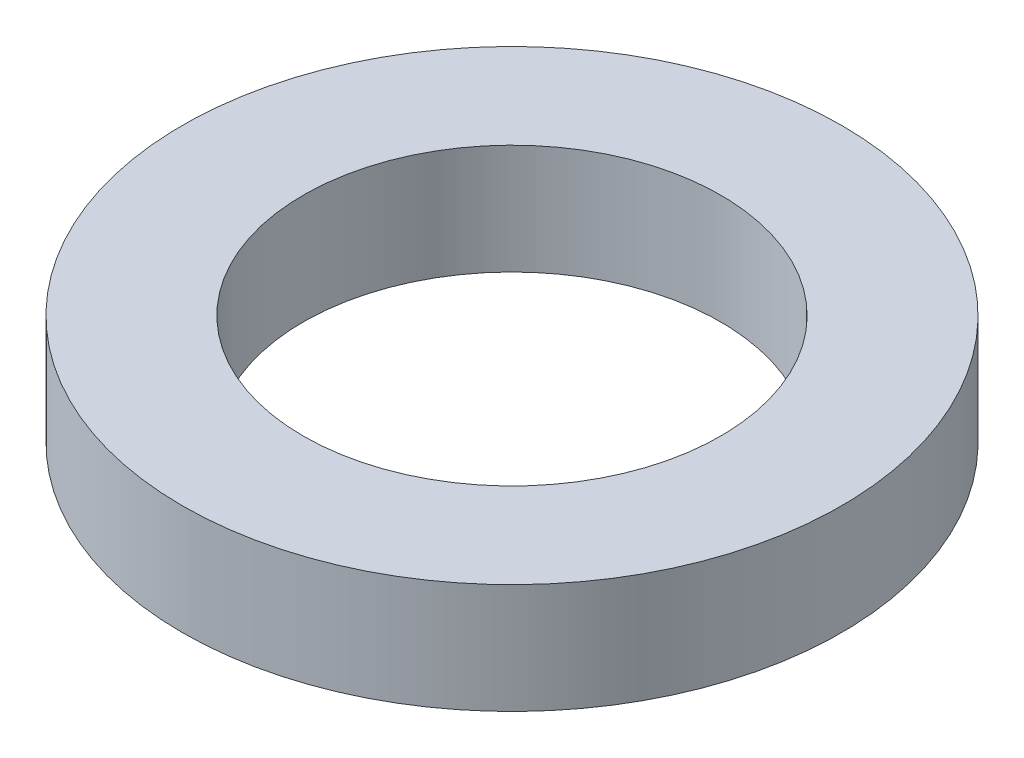
ISO-10303-21;
HEADER;
FILE_DESCRIPTION(('STEP AP214'),'2;1');
FILE_NAME('part.step','',(''),(''),'','','');
FILE_SCHEMA(('AUTOMOTIVE_DESIGN { 1 0 10303 214 1 1 1 1 }'));
ENDSEC;
DATA;
#1=APPLICATION_CONTEXT('core data for automotive mechanical design processes');
#2=APPLICATION_PROTOCOL_DEFINITION('international standard','automotive_design',2000,#1);
#3=PRODUCT_CONTEXT('',#1,'mechanical');
#4=PRODUCT('Part','Part','',(#3));
#5=PRODUCT_RELATED_PRODUCT_CATEGORY('part','',(#4));
#6=PRODUCT_DEFINITION_FORMATION('','',#4);
#7=PRODUCT_DEFINITION_CONTEXT('part definition',#1,'design');
#8=PRODUCT_DEFINITION('design','',#6,#7);
#9=PRODUCT_DEFINITION_SHAPE('','',#8);
#10=(LENGTH_UNIT() NAMED_UNIT(*) SI_UNIT(.MILLI.,.METRE.));
#11=(NAMED_UNIT(*) PLANE_ANGLE_UNIT() SI_UNIT($,.RADIAN.));
#12=(NAMED_UNIT(*) SI_UNIT($,.STERADIAN.) SOLID_ANGLE_UNIT());
#13=UNCERTAINTY_MEASURE_WITH_UNIT(LENGTH_MEASURE(1.E-05),#10,'distance_accuracy_value','');
#14=(GEOMETRIC_REPRESENTATION_CONTEXT(3) GLOBAL_UNCERTAINTY_ASSIGNED_CONTEXT((#13)) GLOBAL_UNIT_ASSIGNED_CONTEXT((#10,
#11,#12)) REPRESENTATION_CONTEXT('',''));
#15=CARTESIAN_POINT('',(0.,0.,0.));
#16=DIRECTION('',(0.,0.,1.));
#17=DIRECTION('',(1.,0.,0.));
#18=AXIS2_PLACEMENT_3D('',#15,#16,#17);
#19=CARTESIAN_POINT('',(0.,1.,0.));
#20=DIRECTION('',(0.,1.,0.));
#21=DIRECTION('',(0.,0.,1.));
#22=AXIS2_PLACEMENT_3D('',#19,#20,#21);
#23=PLANE('',#22);
#24=CARTESIAN_POINT('',(0.,1.,0.));
#25=DIRECTION('',(0.,1.,0.));
#26=DIRECTION('',(0.,0.,1.));
#27=AXIS2_PLACEMENT_3D('',#24,#25,#26);
#28=CIRCLE('',#27,3.);
#29=CARTESIAN_POINT('',(0.,1.,3.));
#30=VERTEX_POINT('',#29);
#31=EDGE_CURVE('E10',#30,#30,#28,.T.);
#32=ORIENTED_EDGE('',*,*,#31,.T.);
#33=EDGE_LOOP('',(#32));
#34=FACE_BOUND('',#33,.T.);
#35=CARTESIAN_POINT('',(0.,1.,0.));
#36=DIRECTION('',(0.,1.,0.));
#37=DIRECTION('',(0.,0.,1.));
#38=AXIS2_PLACEMENT_3D('',#35,#36,#37);
#39=CIRCLE('',#38,1.9);
#40=CARTESIAN_POINT('',(0.,1.,1.9));
#41=VERTEX_POINT('',#40);
#42=EDGE_CURVE('E54',#41,#41,#39,.T.);
#43=ORIENTED_EDGE('',*,*,#42,.F.);
#44=EDGE_LOOP('',(#43));
#45=FACE_BOUND('',#44,.T.);
#46=ADVANCED_FACE('F41',(#34,#45),#23,.T.);
#47=CARTESIAN_POINT('',(0.,0.,0.));
#48=DIRECTION('',(0.,1.,0.));
#49=DIRECTION('',(0.,0.,1.));
#50=AXIS2_PLACEMENT_3D('',#47,#48,#49);
#51=PLANE('',#50);
#52=CARTESIAN_POINT('',(0.,0.,0.));
#53=DIRECTION('',(0.,1.,0.));
#54=DIRECTION('',(0.,0.,1.));
#55=AXIS2_PLACEMENT_3D('',#52,#53,#54);
#56=CIRCLE('',#55,3.);
#57=CARTESIAN_POINT('',(0.,0.,3.));
#58=VERTEX_POINT('',#57);
#59=EDGE_CURVE('E45',#58,#58,#56,.T.);
#60=ORIENTED_EDGE('',*,*,#59,.F.);
#61=EDGE_LOOP('',(#60));
#62=FACE_BOUND('',#61,.T.);
#63=CARTESIAN_POINT('',(0.,0.,0.));
#64=DIRECTION('',(0.,1.,0.));
#65=DIRECTION('',(0.,0.,1.));
#66=AXIS2_PLACEMENT_3D('',#63,#64,#65);
#67=CIRCLE('',#66,1.9);
#68=CARTESIAN_POINT('',(0.,0.,1.9));
#69=VERTEX_POINT('',#68);
#70=EDGE_CURVE('E56',#69,#69,#67,.T.);
#71=ORIENTED_EDGE('',*,*,#70,.T.);
#72=EDGE_LOOP('',(#71));
#73=FACE_BOUND('',#72,.T.);
#74=ADVANCED_FACE('F68',(#62,#73),#51,.F.);
#75=CARTESIAN_POINT('',(0.,1.,0.));
#76=DIRECTION('',(0.,-1.,0.));
#77=DIRECTION('',(0.,0.,-1.));
#78=AXIS2_PLACEMENT_3D('',#75,#76,#77);
#79=CYLINDRICAL_SURFACE('',#78,3.);
#80=ORIENTED_EDGE('',*,*,#31,.F.);
#81=EDGE_LOOP('',(#80));
#82=FACE_BOUND('',#81,.T.);
#83=ORIENTED_EDGE('',*,*,#59,.T.);
#84=EDGE_LOOP('',(#83));
#85=FACE_BOUND('',#84,.T.);
#86=ADVANCED_FACE('F43',(#82,#85),#79,.T.);
#87=CARTESIAN_POINT('',(0.,1.,0.));
#88=DIRECTION('',(0.,-1.,0.));
#89=DIRECTION('',(0.,0.,-1.));
#90=AXIS2_PLACEMENT_3D('',#87,#88,#89);
#91=CYLINDRICAL_SURFACE('',#90,1.9);
#92=ORIENTED_EDGE('',*,*,#42,.T.);
#93=EDGE_LOOP('',(#92));
#94=FACE_BOUND('',#93,.T.);
#95=ORIENTED_EDGE('',*,*,#70,.F.);
#96=EDGE_LOOP('',(#95));
#97=FACE_BOUND('',#96,.T.);
#98=ADVANCED_FACE('F64',(#94,#97),#91,.F.);
#99=CLOSED_SHELL('',(#46,#74,#86,#98));
#100=MANIFOLD_SOLID_BREP('B2',#99);
#101=ADVANCED_BREP_SHAPE_REPRESENTATION('',(#18,#100),#14);
#102=SHAPE_DEFINITION_REPRESENTATION(#9,#101);
ENDSEC;
END-ISO-10303-21;
